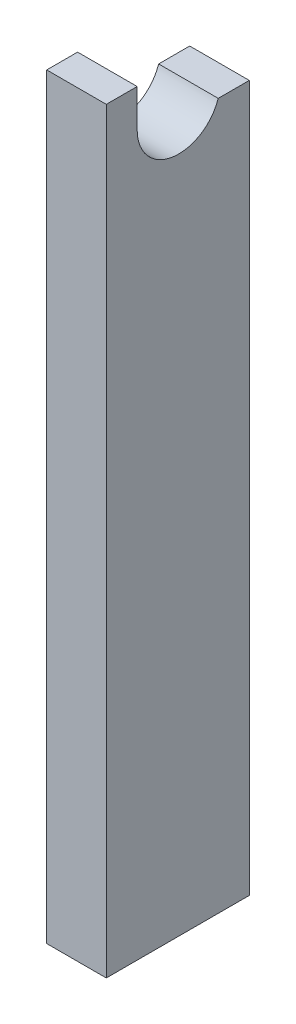
ISO-10303-21;
HEADER;
FILE_DESCRIPTION(('STEP AP214'),'2;1');
FILE_NAME('part.step','',(''),(''),'','','');
FILE_SCHEMA(('AUTOMOTIVE_DESIGN { 1 0 10303 214 1 1 1 1 }'));
ENDSEC;
DATA;
#1=APPLICATION_CONTEXT('core data for automotive mechanical design processes');
#2=APPLICATION_PROTOCOL_DEFINITION('international standard','automotive_design',2000,#1);
#3=PRODUCT_CONTEXT('',#1,'mechanical');
#4=PRODUCT('Part','Part','',(#3));
#5=PRODUCT_RELATED_PRODUCT_CATEGORY('part','',(#4));
#6=PRODUCT_DEFINITION_FORMATION('','',#4);
#7=PRODUCT_DEFINITION_CONTEXT('part definition',#1,'design');
#8=PRODUCT_DEFINITION('design','',#6,#7);
#9=PRODUCT_DEFINITION_SHAPE('','',#8);
#10=(LENGTH_UNIT() NAMED_UNIT(*) SI_UNIT(.MILLI.,.METRE.));
#11=(NAMED_UNIT(*) PLANE_ANGLE_UNIT() SI_UNIT($,.RADIAN.));
#12=(NAMED_UNIT(*) SI_UNIT($,.STERADIAN.) SOLID_ANGLE_UNIT());
#13=UNCERTAINTY_MEASURE_WITH_UNIT(LENGTH_MEASURE(1.E-05),#10,'distance_accuracy_value','');
#14=(GEOMETRIC_REPRESENTATION_CONTEXT(3) GLOBAL_UNCERTAINTY_ASSIGNED_CONTEXT((#13)) GLOBAL_UNIT_ASSIGNED_CONTEXT((#10,
#11,#12)) REPRESENTATION_CONTEXT('',''));
#15=CARTESIAN_POINT('',(0.,0.,0.));
#16=DIRECTION('',(0.,0.,1.));
#17=DIRECTION('',(1.,0.,0.));
#18=AXIS2_PLACEMENT_3D('',#15,#16,#17);
#19=CARTESIAN_POINT('',(-329.666747800287,-12.2878593488723,577.545278836221));
#20=DIRECTION('',(0.,0.,-1.));
#21=DIRECTION('',(-1.,0.,0.));
#22=AXIS2_PLACEMENT_3D('',#19,#20,#21);
#23=PLANE('',#22);
#24=DIRECTION('',(0.,-1.,0.));
#25=VECTOR('',#24,1.);
#26=CARTESIAN_POINT('',(-334.666747800287,-12.2878593488723,577.545278836221));
#27=LINE('',#26,#25);
#28=CARTESIAN_POINT('',(-334.666747800287,51.2084295447601,577.545278836221));
#29=VERTEX_POINT('',#28);
#30=CARTESIAN_POINT('',(-334.666747800287,-12.2878593488723,577.545278836221));
#31=VERTEX_POINT('',#30);
#32=EDGE_CURVE('E129',#29,#31,#27,.T.);
#33=ORIENTED_EDGE('',*,*,#32,.T.);
#34=DIRECTION('',(-1.,0.,0.));
#35=VECTOR('',#34,1.);
#36=CARTESIAN_POINT('',(-329.666747800287,-12.2878593488723,577.545278836221));
#37=LINE('',#36,#35);
#38=CARTESIAN_POINT('',(-329.666747800287,-12.2878593488723,577.545278836221));
#39=VERTEX_POINT('',#38);
#40=EDGE_CURVE('E11',#39,#31,#37,.T.);
#41=ORIENTED_EDGE('',*,*,#40,.F.);
#42=DIRECTION('',(0.,-1.,0.));
#43=VECTOR('',#42,1.);
#44=CARTESIAN_POINT('',(-329.666747800287,-12.2878593488723,577.545278836221));
#45=LINE('',#44,#43);
#46=CARTESIAN_POINT('',(-329.666747800287,51.2084295447601,577.545278836221));
#47=VERTEX_POINT('',#46);
#48=EDGE_CURVE('E142',#47,#39,#45,.T.);
#49=ORIENTED_EDGE('',*,*,#48,.F.);
#50=DIRECTION('',(-1.,0.,0.));
#51=VECTOR('',#50,1.);
#52=CARTESIAN_POINT('',(-329.666747800287,51.2084295447601,577.545278836221));
#53=LINE('',#52,#51);
#54=EDGE_CURVE('E125',#47,#29,#53,.T.);
#55=ORIENTED_EDGE('',*,*,#54,.T.);
#56=EDGE_LOOP('',(#33,#41,#49,#55));
#57=FACE_BOUND('',#56,.T.);
#58=ADVANCED_FACE('F39',(#57),#23,.F.);
#59=CARTESIAN_POINT('',(-329.666747800287,-12.2878593488723,577.545278836221));
#60=DIRECTION('',(0.,1.,0.));
#61=DIRECTION('',(0.,0.,1.));
#62=AXIS2_PLACEMENT_3D('',#59,#60,#61);
#63=PLANE('',#62);
#64=DIRECTION('',(0.,0.,-1.));
#65=VECTOR('',#64,1.);
#66=CARTESIAN_POINT('',(-334.666747800287,-12.2878593488723,577.545278836221));
#67=LINE('',#66,#65);
#68=CARTESIAN_POINT('',(-334.666747800287,-12.2878593488723,565.545278836221));
#69=VERTEX_POINT('',#68);
#70=EDGE_CURVE('E132',#31,#69,#67,.T.);
#71=ORIENTED_EDGE('',*,*,#70,.T.);
#72=DIRECTION('',(-1.,0.,0.));
#73=VECTOR('',#72,1.);
#74=CARTESIAN_POINT('',(-329.666747800287,-12.2878593488723,565.545278836221));
#75=LINE('',#74,#73);
#76=CARTESIAN_POINT('',(-329.666747800287,-12.2878593488723,565.545278836221));
#77=VERTEX_POINT('',#76);
#78=EDGE_CURVE('E47',#77,#69,#75,.T.);
#79=ORIENTED_EDGE('',*,*,#78,.F.);
#80=DIRECTION('',(0.,0.,-1.));
#81=VECTOR('',#80,1.);
#82=CARTESIAN_POINT('',(-329.666747800287,-12.2878593488723,577.545278836221));
#83=LINE('',#82,#81);
#84=EDGE_CURVE('E95',#39,#77,#83,.T.);
#85=ORIENTED_EDGE('',*,*,#84,.F.);
#86=ORIENTED_EDGE('',*,*,#40,.T.);
#87=EDGE_LOOP('',(#71,#79,#85,#86));
#88=FACE_BOUND('',#87,.T.);
#89=ADVANCED_FACE('F154',(#88),#63,.F.);
#90=CARTESIAN_POINT('',(-329.666747800287,46.9467131396495,565.545278836221));
#91=DIRECTION('',(0.,0.,1.));
#92=DIRECTION('',(1.,0.,0.));
#93=AXIS2_PLACEMENT_3D('',#90,#91,#92);
#94=PLANE('',#93);
#95=DIRECTION('',(0.,1.,0.));
#96=VECTOR('',#95,1.);
#97=CARTESIAN_POINT('',(-334.666747800287,46.9467131396495,565.545278836221));
#98=LINE('',#97,#96);
#99=CARTESIAN_POINT('',(-334.666747800287,46.9467131396495,565.545278836221));
#100=VERTEX_POINT('',#99);
#101=EDGE_CURVE('E135',#69,#100,#98,.T.);
#102=ORIENTED_EDGE('',*,*,#101,.T.);
#103=DIRECTION('',(-1.,0.,0.));
#104=VECTOR('',#103,1.);
#105=CARTESIAN_POINT('',(-329.666747800287,46.9467131396495,565.545278836221));
#106=LINE('',#105,#104);
#107=CARTESIAN_POINT('',(-329.666747800287,46.9467131396495,565.545278836221));
#108=VERTEX_POINT('',#107);
#109=EDGE_CURVE('E146',#108,#100,#106,.T.);
#110=ORIENTED_EDGE('',*,*,#109,.F.);
#111=DIRECTION('',(0.,1.,0.));
#112=VECTOR('',#111,1.);
#113=CARTESIAN_POINT('',(-329.666747800287,-12.2878593488723,565.545278836221));
#114=LINE('',#113,#112);
#115=EDGE_CURVE('E153',#77,#108,#114,.T.);
#116=ORIENTED_EDGE('',*,*,#115,.F.);
#117=ORIENTED_EDGE('',*,*,#78,.T.);
#118=EDGE_LOOP('',(#102,#110,#116,#117));
#119=FACE_BOUND('',#118,.T.);
#120=ADVANCED_FACE('F151',(#119),#94,.F.);
#121=CARTESIAN_POINT('',(-329.666747800287,46.9467131396495,568.152554161311));
#122=DIRECTION('',(0.,-1.,0.));
#123=DIRECTION('',(0.,0.,-1.));
#124=AXIS2_PLACEMENT_3D('',#121,#122,#123);
#125=PLANE('',#124);
#126=DIRECTION('',(0.,0.,1.));
#127=VECTOR('',#126,1.);
#128=CARTESIAN_POINT('',(-334.666747800287,46.9467131396495,568.152554161311));
#129=LINE('',#128,#127);
#130=CARTESIAN_POINT('',(-334.666747800287,46.9467131396495,568.152554161311));
#131=VERTEX_POINT('',#130);
#132=EDGE_CURVE('E137',#100,#131,#129,.T.);
#133=ORIENTED_EDGE('',*,*,#132,.T.);
#134=DIRECTION('',(-1.,0.,0.));
#135=VECTOR('',#134,1.);
#136=CARTESIAN_POINT('',(-329.666747800287,46.9467131396495,568.152554161311));
#137=LINE('',#136,#135);
#138=CARTESIAN_POINT('',(-329.666747800287,46.9467131396495,568.152554161311));
#139=VERTEX_POINT('',#138);
#140=EDGE_CURVE('E120',#139,#131,#137,.T.);
#141=ORIENTED_EDGE('',*,*,#140,.F.);
#142=DIRECTION('',(0.,0.,1.));
#143=VECTOR('',#142,1.);
#144=CARTESIAN_POINT('',(-329.666747800287,46.9467131396495,568.152554161311));
#145=LINE('',#144,#143);
#146=EDGE_CURVE('E111',#108,#139,#145,.T.);
#147=ORIENTED_EDGE('',*,*,#146,.F.);
#148=ORIENTED_EDGE('',*,*,#109,.T.);
#149=EDGE_LOOP('',(#133,#141,#147,#148));
#150=FACE_BOUND('',#149,.T.);
#151=ADVANCED_FACE('F161',(#150),#125,.F.);
#152=CARTESIAN_POINT('',(-329.666747800287,48.0468744210161,571.465036751883));
#153=DIRECTION('',(-1.,0.,0.));
#154=DIRECTION('',(0.,0.,1.));
#155=AXIS2_PLACEMENT_3D('',#152,#153,#154);
#156=CYLINDRICAL_SURFACE('',#155,3.4904005153931);
#157=CARTESIAN_POINT('',(-334.666747800287,48.0468744210161,571.465036751883));
#158=DIRECTION('',(-1.,0.,0.));
#159=DIRECTION('',(0.,0.,-1.));
#160=AXIS2_PLACEMENT_3D('',#157,#158,#159);
#161=CIRCLE('',#160,3.4904005153931);
#162=CARTESIAN_POINT('',(-334.666747800287,48.0468744210161,574.955437267276));
#163=VERTEX_POINT('',#162);
#164=EDGE_CURVE('E119',#131,#163,#161,.T.);
#165=ORIENTED_EDGE('',*,*,#164,.T.);
#166=DIRECTION('',(-1.,0.,0.));
#167=VECTOR('',#166,1.);
#168=CARTESIAN_POINT('',(-329.666747800287,48.0468744210161,574.955437267276));
#169=LINE('',#168,#167);
#170=CARTESIAN_POINT('',(-329.666747800287,48.0468744210161,574.955437267276));
#171=VERTEX_POINT('',#170);
#172=EDGE_CURVE('E116',#171,#163,#169,.T.);
#173=ORIENTED_EDGE('',*,*,#172,.F.);
#174=CARTESIAN_POINT('',(-329.666747800287,48.0468744210161,571.465036751883));
#175=DIRECTION('',(-1.,0.,0.));
#176=DIRECTION('',(0.,0.,-1.));
#177=AXIS2_PLACEMENT_3D('',#174,#175,#176);
#178=CIRCLE('',#177,3.4904005153931);
#179=EDGE_CURVE('E105',#139,#171,#178,.T.);
#180=ORIENTED_EDGE('',*,*,#179,.F.);
#181=ORIENTED_EDGE('',*,*,#140,.T.);
#182=EDGE_LOOP('',(#165,#173,#180,#181));
#183=FACE_BOUND('',#182,.T.);
#184=ADVANCED_FACE('F117',(#183),#156,.F.);
#185=CARTESIAN_POINT('',(-329.666747800287,51.2084295447601,574.955437267276));
#186=DIRECTION('',(0.,0.,1.));
#187=DIRECTION('',(1.,0.,0.));
#188=AXIS2_PLACEMENT_3D('',#185,#186,#187);
#189=PLANE('',#188);
#190=DIRECTION('',(0.,1.,0.));
#191=VECTOR('',#190,1.);
#192=CARTESIAN_POINT('',(-334.666747800287,51.2084295447601,574.955437267276));
#193=LINE('',#192,#191);
#194=CARTESIAN_POINT('',(-334.666747800287,51.2084295447601,574.955437267276));
#195=VERTEX_POINT('',#194);
#196=EDGE_CURVE('E81',#163,#195,#193,.T.);
#197=ORIENTED_EDGE('',*,*,#196,.T.);
#198=DIRECTION('',(-1.,0.,0.));
#199=VECTOR('',#198,1.);
#200=CARTESIAN_POINT('',(-329.666747800287,51.2084295447601,574.955437267276));
#201=LINE('',#200,#199);
#202=CARTESIAN_POINT('',(-329.666747800287,51.2084295447601,574.955437267276));
#203=VERTEX_POINT('',#202);
#204=EDGE_CURVE('E121',#203,#195,#201,.T.);
#205=ORIENTED_EDGE('',*,*,#204,.F.);
#206=DIRECTION('',(0.,1.,0.));
#207=VECTOR('',#206,1.);
#208=CARTESIAN_POINT('',(-329.666747800287,51.2084295447601,574.955437267276));
#209=LINE('',#208,#207);
#210=EDGE_CURVE('E109',#171,#203,#209,.T.);
#211=ORIENTED_EDGE('',*,*,#210,.F.);
#212=ORIENTED_EDGE('',*,*,#172,.T.);
#213=EDGE_LOOP('',(#197,#205,#211,#212));
#214=FACE_BOUND('',#213,.T.);
#215=ADVANCED_FACE('F123',(#214),#189,.F.);
#216=CARTESIAN_POINT('',(-329.666747800287,51.2084295447601,577.545278836221));
#217=DIRECTION('',(0.,-1.,0.));
#218=DIRECTION('',(0.,0.,-1.));
#219=AXIS2_PLACEMENT_3D('',#216,#217,#218);
#220=PLANE('',#219);
#221=DIRECTION('',(0.,0.,1.));
#222=VECTOR('',#221,1.);
#223=CARTESIAN_POINT('',(-334.666747800287,51.2084295447601,577.545278836221));
#224=LINE('',#223,#222);
#225=EDGE_CURVE('E87',#195,#29,#224,.T.);
#226=ORIENTED_EDGE('',*,*,#225,.T.);
#227=ORIENTED_EDGE('',*,*,#54,.F.);
#228=DIRECTION('',(0.,0.,1.));
#229=VECTOR('',#228,1.);
#230=CARTESIAN_POINT('',(-329.666747800287,51.2084295447601,577.545278836221));
#231=LINE('',#230,#229);
#232=EDGE_CURVE('E55',#203,#47,#231,.T.);
#233=ORIENTED_EDGE('',*,*,#232,.F.);
#234=ORIENTED_EDGE('',*,*,#204,.T.);
#235=EDGE_LOOP('',(#226,#227,#233,#234));
#236=FACE_BOUND('',#235,.T.);
#237=ADVANCED_FACE('F167',(#236),#220,.F.);
#238=CARTESIAN_POINT('',(-329.666747800287,48.0468744210161,571.465036751883));
#239=DIRECTION('',(1.,0.,0.));
#240=DIRECTION('',(0.,0.,-1.));
#241=AXIS2_PLACEMENT_3D('',#238,#239,#240);
#242=PLANE('',#241);
#243=ORIENTED_EDGE('',*,*,#48,.T.);
#244=ORIENTED_EDGE('',*,*,#84,.T.);
#245=ORIENTED_EDGE('',*,*,#115,.T.);
#246=ORIENTED_EDGE('',*,*,#146,.T.);
#247=ORIENTED_EDGE('',*,*,#179,.T.);
#248=ORIENTED_EDGE('',*,*,#210,.T.);
#249=ORIENTED_EDGE('',*,*,#232,.T.);
#250=EDGE_LOOP('',(#243,#244,#245,#246,#247,#248,#249));
#251=FACE_BOUND('',#250,.T.);
#252=ADVANCED_FACE('F107',(#251),#242,.T.);
#253=CARTESIAN_POINT('',(-334.666747800287,48.0468744210161,571.465036751883));
#254=DIRECTION('',(1.,0.,0.));
#255=DIRECTION('',(0.,0.,-1.));
#256=AXIS2_PLACEMENT_3D('',#253,#254,#255);
#257=PLANE('',#256);
#258=ORIENTED_EDGE('',*,*,#32,.F.);
#259=ORIENTED_EDGE('',*,*,#225,.F.);
#260=ORIENTED_EDGE('',*,*,#196,.F.);
#261=ORIENTED_EDGE('',*,*,#164,.F.);
#262=ORIENTED_EDGE('',*,*,#132,.F.);
#263=ORIENTED_EDGE('',*,*,#101,.F.);
#264=ORIENTED_EDGE('',*,*,#70,.F.);
#265=EDGE_LOOP('',(#258,#259,#260,#261,#262,#263,#264));
#266=FACE_BOUND('',#265,.T.);
#267=ADVANCED_FACE('F158',(#266),#257,.F.);
#268=CLOSED_SHELL('',(#58,#89,#120,#151,#184,#215,#237,#252,#267));
#269=MANIFOLD_SOLID_BREP('B2',#268);
#270=ADVANCED_BREP_SHAPE_REPRESENTATION('',(#18,#269),#14);
#271=SHAPE_DEFINITION_REPRESENTATION(#9,#270);
ENDSEC;
END-ISO-10303-21;
